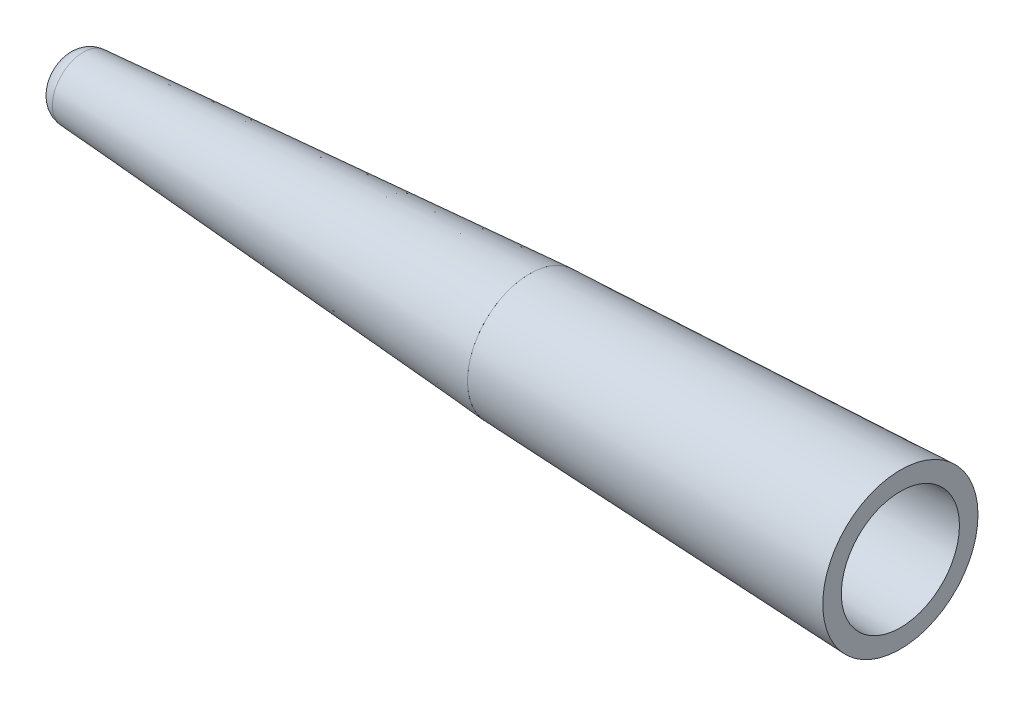
ISO-10303-21;
HEADER;
FILE_DESCRIPTION(('STEP AP214'),'2;1');
FILE_NAME('part.step','',(''),(''),'','','');
FILE_SCHEMA(('AUTOMOTIVE_DESIGN { 1 0 10303 214 1 1 1 1 }'));
ENDSEC;
DATA;
#1=APPLICATION_CONTEXT('core data for automotive mechanical design processes');
#2=APPLICATION_PROTOCOL_DEFINITION('international standard','automotive_design',2000,#1);
#3=PRODUCT_CONTEXT('',#1,'mechanical');
#4=PRODUCT('Part','Part','',(#3));
#5=PRODUCT_RELATED_PRODUCT_CATEGORY('part','',(#4));
#6=PRODUCT_DEFINITION_FORMATION('','',#4);
#7=PRODUCT_DEFINITION_CONTEXT('part definition',#1,'design');
#8=PRODUCT_DEFINITION('design','',#6,#7);
#9=PRODUCT_DEFINITION_SHAPE('','',#8);
#10=(LENGTH_UNIT() NAMED_UNIT(*) SI_UNIT(.MILLI.,.METRE.));
#11=(NAMED_UNIT(*) PLANE_ANGLE_UNIT() SI_UNIT($,.RADIAN.));
#12=(NAMED_UNIT(*) SI_UNIT($,.STERADIAN.) SOLID_ANGLE_UNIT());
#13=UNCERTAINTY_MEASURE_WITH_UNIT(LENGTH_MEASURE(1.E-05),#10,'distance_accuracy_value','');
#14=(GEOMETRIC_REPRESENTATION_CONTEXT(3) GLOBAL_UNCERTAINTY_ASSIGNED_CONTEXT((#13)) GLOBAL_UNIT_ASSIGNED_CONTEXT((#10,
#11,#12)) REPRESENTATION_CONTEXT('',''));
#15=CARTESIAN_POINT('',(0.,0.,0.));
#16=DIRECTION('',(0.,0.,1.));
#17=DIRECTION('',(1.,0.,0.));
#18=AXIS2_PLACEMENT_3D('',#15,#16,#17);
#19=CARTESIAN_POINT('',(50.,0.,0.));
#20=DIRECTION('',(1.,0.,0.));
#21=DIRECTION('',(0.,0.,-1.));
#22=AXIS2_PLACEMENT_3D('',#19,#20,#21);
#23=CONICAL_SURFACE('',#22,4.69458471716816,0.0418879020478642);
#24=CARTESIAN_POINT('',(50.,0.,0.));
#25=DIRECTION('',(1.,0.,0.));
#26=DIRECTION('',(0.,0.,-1.));
#27=AXIS2_PLACEMENT_3D('',#24,#25,#26);
#28=CIRCLE('',#27,4.69458471716816);
#29=CARTESIAN_POINT('',(50.,0.,-4.69458471716816));
#30=VERTEX_POINT('',#29);
#31=EDGE_CURVE('E12',#30,#30,#28,.T.);
#32=ORIENTED_EDGE('',*,*,#31,.F.);
#33=EDGE_LOOP('',(#32));
#34=FACE_BOUND('',#33,.T.);
#35=CARTESIAN_POINT('',(90.,0.,0.));
#36=DIRECTION('',(1.,0.,0.));
#37=DIRECTION('',(0.,0.,-1.));
#38=AXIS2_PLACEMENT_3D('',#35,#36,#37);
#39=CIRCLE('',#38,6.37108143879974);
#40=CARTESIAN_POINT('',(90.,0.,-6.37108143879974));
#41=VERTEX_POINT('',#40);
#42=EDGE_CURVE('E65',#41,#41,#39,.T.);
#43=ORIENTED_EDGE('',*,*,#42,.T.);
#44=EDGE_LOOP('',(#43));
#45=FACE_BOUND('',#44,.T.);
#46=ADVANCED_FACE('F51',(#34,#45),#23,.F.);
#47=CARTESIAN_POINT('',(180.,0.,0.));
#48=DIRECTION('',(1.,0.,0.));
#49=DIRECTION('',(0.,0.,-1.));
#50=AXIS2_PLACEMENT_3D('',#47,#48,#49);
#51=CONICAL_SURFACE('',#50,12.1449549424782,0.0418879020478642);
#52=CARTESIAN_POINT('',(50.,0.,0.));
#53=DIRECTION('',(1.,0.,0.));
#54=DIRECTION('',(0.,0.,-1.));
#55=AXIS2_PLACEMENT_3D('',#52,#53,#54);
#56=CIRCLE('',#55,6.69634059717554);
#57=CARTESIAN_POINT('',(50.,0.,-6.69634059717554));
#58=VERTEX_POINT('',#57);
#59=EDGE_CURVE('E60',#58,#58,#56,.T.);
#60=ORIENTED_EDGE('',*,*,#59,.T.);
#61=EDGE_LOOP('',(#60));
#62=FACE_BOUND('',#61,.T.);
#63=CARTESIAN_POINT('',(90.,0.,0.));
#64=DIRECTION('',(1.,0.,0.));
#65=DIRECTION('',(0.,0.,-1.));
#66=AXIS2_PLACEMENT_3D('',#63,#64,#65);
#67=CIRCLE('',#66,8.37283731880711);
#68=CARTESIAN_POINT('',(90.,0.,-8.37283731880711));
#69=VERTEX_POINT('',#68);
#70=EDGE_CURVE('E55',#69,#69,#67,.F.);
#71=ORIENTED_EDGE('',*,*,#70,.T.);
#72=EDGE_LOOP('',(#71));
#73=FACE_BOUND('',#72,.T.);
#74=ADVANCED_FACE('F76',(#62,#73),#51,.T.);
#75=CARTESIAN_POINT('',(50.,6.69634059717554,0.));
#76=DIRECTION('',(-1.,0.,0.));
#77=DIRECTION('',(0.,0.,1.));
#78=AXIS2_PLACEMENT_3D('',#75,#76,#77);
#79=PLANE('',#78);
#80=ORIENTED_EDGE('',*,*,#31,.T.);
#81=EDGE_LOOP('',(#80));
#82=FACE_BOUND('',#81,.T.);
#83=ORIENTED_EDGE('',*,*,#59,.F.);
#84=EDGE_LOOP('',(#83));
#85=FACE_BOUND('',#84,.T.);
#86=ADVANCED_FACE('F53',(#82,#85),#79,.T.);
#87=CARTESIAN_POINT('',(90.,0.,0.));
#88=DIRECTION('',(1.,0.,0.));
#89=DIRECTION('',(0.,0.,-1.));
#90=AXIS2_PLACEMENT_3D('',#87,#88,#89);
#91=PLANE('',#90);
#92=ORIENTED_EDGE('',*,*,#42,.F.);
#93=EDGE_LOOP('',(#92));
#94=FACE_BOUND('',#93,.T.);
#95=ORIENTED_EDGE('',*,*,#70,.F.);
#96=EDGE_LOOP('',(#95));
#97=FACE_BOUND('',#96,.T.);
#98=ADVANCED_FACE('F78',(#94,#97),#91,.T.);
#99=CLOSED_SHELL('',(#46,#74,#86,#98));
#100=MANIFOLD_SOLID_BREP('B2',#99);
#101=CARTESIAN_POINT('',(1.99026806874157,0.,0.));
#102=DIRECTION('',(-1.,0.,0.));
#103=DIRECTION('',(0.,0.,1.));
#104=AXIS2_PLACEMENT_3D('',#101,#102,#103);
#105=DEGENERATE_TOROIDAL_SURFACE('',#104,1.33917310096007,1.99512810051965,.T.);
#106=CARTESIAN_POINT('',(0.,0.,0.));
#107=DIRECTION('',(-1.,0.,0.));
#108=DIRECTION('',(0.,0.,1.));
#109=AXIS2_PLACEMENT_3D('',#106,#107,#108);
#110=CIRCLE('',#109,1.2);
#111=CARTESIAN_POINT('',(0.,0.,-1.2));
#112=VERTEX_POINT('',#111);
#113=EDGE_CURVE('E138',#112,#112,#110,.T.);
#114=ORIENTED_EDGE('',*,*,#113,.F.);
#115=EDGE_LOOP('',(#114));
#116=FACE_BOUND('',#115,.T.);
#117=CARTESIAN_POINT('',(1.85109496778151,0.,0.));
#118=DIRECTION('',(-1.,0.,0.));
#119=DIRECTION('',(0.,0.,1.));
#120=AXIS2_PLACEMENT_3D('',#117,#118,#119);
#121=CIRCLE('',#120,3.32944116970164);
#122=CARTESIAN_POINT('',(1.85109496778151,0.,3.32944116970164));
#123=VERTEX_POINT('',#122);
#124=EDGE_CURVE('E50',#123,#123,#121,.T.);
#125=ORIENTED_EDGE('',*,*,#124,.T.);
#126=EDGE_LOOP('',(#125));
#127=FACE_BOUND('',#126,.T.);
#128=ADVANCED_FACE('F124',(#116,#127),#105,.T.);
#129=CARTESIAN_POINT('',(50.,0.,0.));
#130=DIRECTION('',(1.,0.,0.));
#131=DIRECTION('',(0.,0.,-1.));
#132=AXIS2_PLACEMENT_3D('',#129,#130,#131);
#133=CONICAL_SURFACE('',#132,6.69634059717554,0.0698131700797735);
#134=ORIENTED_EDGE('',*,*,#124,.F.);
#135=EDGE_LOOP('',(#134));
#136=FACE_BOUND('',#135,.T.);
#137=CARTESIAN_POINT('',(50.,0.,0.));
#138=DIRECTION('',(-1.,0.,0.));
#139=DIRECTION('',(0.,0.,1.));
#140=AXIS2_PLACEMENT_3D('',#137,#138,#139);
#141=CIRCLE('',#140,6.69634059717554);
#142=CARTESIAN_POINT('',(50.,0.,6.69634059717554));
#143=VERTEX_POINT('',#142);
#144=EDGE_CURVE('E130',#143,#143,#141,.T.);
#145=ORIENTED_EDGE('',*,*,#144,.T.);
#146=EDGE_LOOP('',(#145));
#147=FACE_BOUND('',#146,.T.);
#148=ADVANCED_FACE('F147',(#136,#147),#133,.T.);
#149=CARTESIAN_POINT('',(50.,6.69634059717554,0.));
#150=DIRECTION('',(-1.,0.,0.));
#151=DIRECTION('',(0.,0.,1.));
#152=AXIS2_PLACEMENT_3D('',#149,#150,#151);
#153=PLANE('',#152);
#154=ORIENTED_EDGE('',*,*,#144,.F.);
#155=EDGE_LOOP('',(#154));
#156=FACE_BOUND('',#155,.T.);
#157=CARTESIAN_POINT('',(50.,0.,0.));
#158=DIRECTION('',(-1.,0.,0.));
#159=DIRECTION('',(0.,0.,1.));
#160=AXIS2_PLACEMENT_3D('',#157,#158,#159);
#161=CIRCLE('',#160,4.69634059717554);
#162=CARTESIAN_POINT('',(50.,0.,-4.69634059717554));
#163=VERTEX_POINT('',#162);
#164=EDGE_CURVE('E134',#163,#163,#161,.T.);
#165=ORIENTED_EDGE('',*,*,#164,.T.);
#166=EDGE_LOOP('',(#165));
#167=FACE_BOUND('',#166,.T.);
#168=ADVANCED_FACE('F151',(#156,#167),#153,.F.);
#169=CARTESIAN_POINT('',(0.,0.,0.));
#170=DIRECTION('',(1.,0.,0.));
#171=DIRECTION('',(0.,0.,-1.));
#172=AXIS2_PLACEMENT_3D('',#169,#170,#171);
#173=CONICAL_SURFACE('',#172,1.2,0.0698131700797735);
#174=CARTESIAN_POINT('',(50.,0.,-4.69634059717554));
#175=CARTESIAN_POINT('',(49.4791666666667,0.,-4.65992038262162));
#176=CARTESIAN_POINT('',(48.9583333333333,0.,-4.62350016806771));
#177=CARTESIAN_POINT('',(47.9166666666667,0.,-4.55065973895989));
#178=CARTESIAN_POINT('',(47.3958333333333,0.,-4.51423952440598));
#179=CARTESIAN_POINT('',(46.3541666666667,0.,-4.44139909529815));
#180=CARTESIAN_POINT('',(45.8333333333333,0.,-4.40497888074424));
#181=CARTESIAN_POINT('',(44.7916666666667,0.,-4.33213845163642));
#182=CARTESIAN_POINT('',(44.2708333333333,0.,-4.29571823708251));
#183=CARTESIAN_POINT('',(43.2291666666667,0.,-4.22287780797468));
#184=CARTESIAN_POINT('',(42.7083333333333,0.,-4.18645759342077));
#185=CARTESIAN_POINT('',(41.6666666666667,0.,-4.11361716431295));
#186=CARTESIAN_POINT('',(41.1458333333333,0.,-4.07719694975904));
#187=CARTESIAN_POINT('',(40.1041666666667,0.,-4.00435652065121));
#188=CARTESIAN_POINT('',(39.5833333333333,0.,-3.9679363060973));
#189=CARTESIAN_POINT('',(38.5416666666667,0.,-3.89509587698948));
#190=CARTESIAN_POINT('',(38.0208333333333,0.,-3.85867566243556));
#191=CARTESIAN_POINT('',(36.9791666666667,0.,-3.78583523332774));
#192=CARTESIAN_POINT('',(36.4583333333333,0.,-3.74941501877383));
#193=CARTESIAN_POINT('',(35.4166666666667,0.,-3.67657458966601));
#194=CARTESIAN_POINT('',(34.8958333333333,0.,-3.64015437511209));
#195=CARTESIAN_POINT('',(33.8541666666667,0.,-3.56731394600427));
#196=CARTESIAN_POINT('',(33.3333333333333,0.,-3.53089373145036));
#197=CARTESIAN_POINT('',(32.2916666666667,0.,-3.45805330234253));
#198=CARTESIAN_POINT('',(31.7708333333333,0.,-3.42163308778862));
#199=CARTESIAN_POINT('',(30.7291666666667,0.,-3.3487926586808));
#200=CARTESIAN_POINT('',(30.2083333333333,0.,-3.31237244412689));
#201=CARTESIAN_POINT('',(29.1666666666667,0.,-3.23953201501906));
#202=CARTESIAN_POINT('',(28.6458333333333,0.,-3.20311180046515));
#203=CARTESIAN_POINT('',(27.6041666666667,0.,-3.13027137135733));
#204=CARTESIAN_POINT('',(27.0833333333333,0.,-3.09385115680342));
#205=CARTESIAN_POINT('',(26.0416666666667,0.,-3.02101072769559));
#206=CARTESIAN_POINT('',(25.5208333333333,0.,-2.98459051314168));
#207=CARTESIAN_POINT('',(24.4791666666667,0.,-2.91175008403386));
#208=CARTESIAN_POINT('',(23.9583333333333,0.,-2.87532986947995));
#209=CARTESIAN_POINT('',(22.9166666666667,0.,-2.80248944037212));
#210=CARTESIAN_POINT('',(22.3958333333333,0.,-2.76606922581821));
#211=CARTESIAN_POINT('',(21.3541666666667,0.,-2.69322879671039));
#212=CARTESIAN_POINT('',(20.8333333333333,0.,-2.65680858215647));
#213=CARTESIAN_POINT('',(19.7916666666667,0.,-2.58396815304865));
#214=CARTESIAN_POINT('',(19.2708333333333,0.,-2.54754793849474));
#215=CARTESIAN_POINT('',(18.2291666666667,0.,-2.47470750938691));
#216=CARTESIAN_POINT('',(17.7083333333333,0.,-2.438287294833));
#217=CARTESIAN_POINT('',(16.6666666666667,0.,-2.36544686572518));
#218=CARTESIAN_POINT('',(16.1458333333333,0.,-2.32902665117127));
#219=CARTESIAN_POINT('',(15.1041666666667,0.,-2.25618622206344));
#220=CARTESIAN_POINT('',(14.5833333333333,0.,-2.21976600750953));
#221=CARTESIAN_POINT('',(13.5416666666667,0.,-2.14692557840171));
#222=CARTESIAN_POINT('',(13.0208333333333,0.,-2.1105053638478));
#223=CARTESIAN_POINT('',(11.9791666666667,0.,-2.03766493473997));
#224=CARTESIAN_POINT('',(11.4583333333333,0.,-2.00124472018606));
#225=CARTESIAN_POINT('',(10.4166666666667,0.,-1.92840429107824));
#226=CARTESIAN_POINT('',(9.89583333333334,0.,-1.89198407652432));
#227=CARTESIAN_POINT('',(8.85416666666667,0.,-1.8191436474165));
#228=CARTESIAN_POINT('',(8.33333333333334,0.,-1.78272343286259));
#229=CARTESIAN_POINT('',(7.29166666666667,0.,-1.70988300375477));
#230=CARTESIAN_POINT('',(6.77083333333334,0.,-1.67346278920085));
#231=CARTESIAN_POINT('',(5.72916666666667,0.,-1.60062236009303));
#232=CARTESIAN_POINT('',(5.20833333333333,0.,-1.56420214553912));
#233=CARTESIAN_POINT('',(4.16666666666667,0.,-1.49136171643129));
#234=CARTESIAN_POINT('',(3.64583333333334,0.,-1.45494150187738));
#235=CARTESIAN_POINT('',(2.60416666666667,0.,-1.38210107276956));
#236=CARTESIAN_POINT('',(2.08333333333334,0.,-1.34568085821565));
#237=CARTESIAN_POINT('',(1.04166666666667,0.,-1.27284042910782));
#238=CARTESIAN_POINT('',(0.520833333333338,0.,-1.23642021455391));
#239=CARTESIAN_POINT('',(0.,0.,-1.2));
#240=B_SPLINE_CURVE_WITH_KNOTS('',3,(#174,#175,#176,#177,#178,#179,#180,#181,#182,#183,#184,
#185,#186,#187,#188,#189,#190,#191,#192,#193,#194,#195,#196,#197,#198,#199,#200,#201,#202,#203,
#204,#205,#206,#207,#208,#209,#210,#211,#212,#213,#214,#215,#216,#217,#218,#219,#220,#221,#222,
#223,#224,#225,#226,#227,#228,#229,#230,#231,#232,#233,#234,#235,#236,#237,#238,#239),
.UNSPECIFIED.,.F.,.F.,(4,2,2,2,2,2,2,2,2,2,2,2,2,2,2,2,2,2,2,2,2,2,2,2,2,2,2,2,2,2,2,2,4),(0.,
1.56631546575183,3.13263093150367,4.69894639725549,6.26526186300732,7.83157732875916,
9.39789279451098,10.9642082602628,12.5305237260147,14.0968391917665,15.6631546575183,
17.2294701232701,18.795785589022,20.3621010547738,21.9284165205256,23.4947319862775,
25.0610474520293,26.6273629177811,28.193678383533,29.7599938492848,31.3263093150366,
32.8926247807885,34.4589402465403,36.0252557122921,37.5915711780439,39.1578866437958,
40.7242021095476,42.2905175752994,43.8568330410513,45.4231485068031,46.9894639725549,
48.5557794383068,50.1220949040586),.UNSPECIFIED.);
#241=EDGE_CURVE('BSEAM144',#163,#112,#240,.T.);
#242=ORIENTED_EDGE('',*,*,#164,.F.);
#243=ORIENTED_EDGE('',*,*,#113,.T.);
#244=ORIENTED_EDGE('',*,*,#241,.T.);
#245=ORIENTED_EDGE('',*,*,#241,.F.);
#246=EDGE_LOOP('',(#242,#244,#243,#245));
#247=FACE_BOUND('',#246,.T.);
#248=ADVANCED_FACE('F144',(#247),#173,.F.);
#249=CLOSED_SHELL('',(#128,#148,#168,#248));
#250=MANIFOLD_SOLID_BREP('B7',#249);
#251=ADVANCED_BREP_SHAPE_REPRESENTATION('',(#18,#100,#250),#14);
#252=SHAPE_DEFINITION_REPRESENTATION(#9,#251);
ENDSEC;
END-ISO-10303-21;
